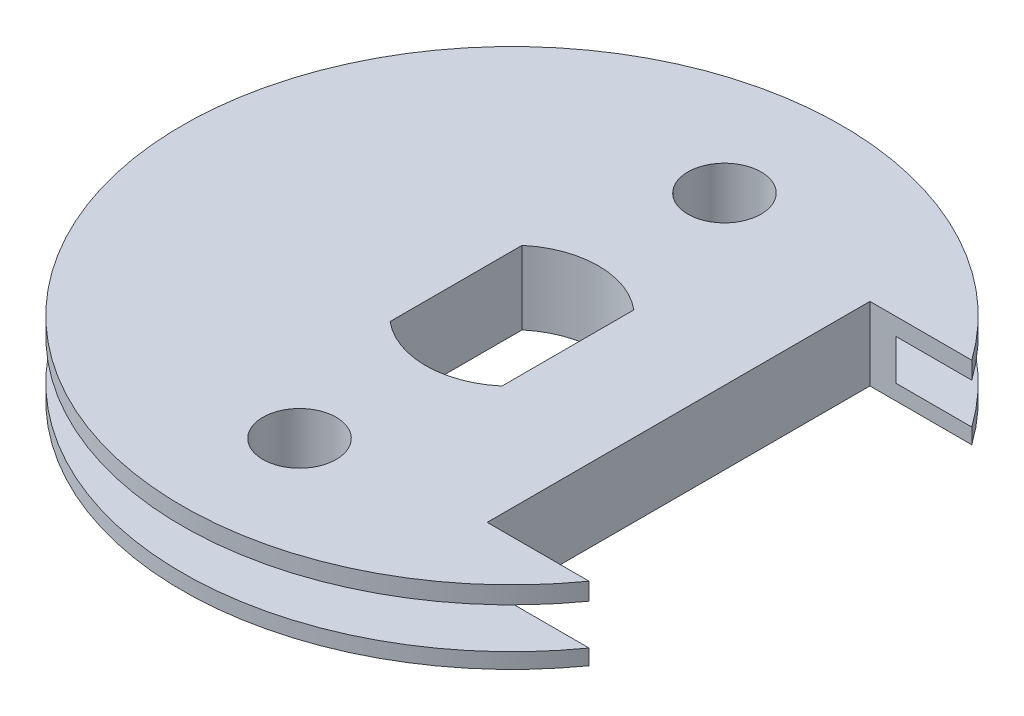
ISO-10303-21;
HEADER;
FILE_DESCRIPTION(('STEP AP214'),'2;1');
FILE_NAME('part.step','',(''),(''),'','','');
FILE_SCHEMA(('AUTOMOTIVE_DESIGN { 1 0 10303 214 1 1 1 1 }'));
ENDSEC;
DATA;
#1=APPLICATION_CONTEXT('core data for automotive mechanical design processes');
#2=APPLICATION_PROTOCOL_DEFINITION('international standard','automotive_design',2000,#1);
#3=PRODUCT_CONTEXT('',#1,'mechanical');
#4=PRODUCT('Part','Part','',(#3));
#5=PRODUCT_RELATED_PRODUCT_CATEGORY('part','',(#4));
#6=PRODUCT_DEFINITION_FORMATION('','',#4);
#7=PRODUCT_DEFINITION_CONTEXT('part definition',#1,'design');
#8=PRODUCT_DEFINITION('design','',#6,#7);
#9=PRODUCT_DEFINITION_SHAPE('','',#8);
#10=(LENGTH_UNIT() NAMED_UNIT(*) SI_UNIT(.MILLI.,.METRE.));
#11=(NAMED_UNIT(*) PLANE_ANGLE_UNIT() SI_UNIT($,.RADIAN.));
#12=(NAMED_UNIT(*) SI_UNIT($,.STERADIAN.) SOLID_ANGLE_UNIT());
#13=UNCERTAINTY_MEASURE_WITH_UNIT(LENGTH_MEASURE(1.E-05),#10,'distance_accuracy_value','');
#14=(GEOMETRIC_REPRESENTATION_CONTEXT(3) GLOBAL_UNCERTAINTY_ASSIGNED_CONTEXT((#13)) GLOBAL_UNIT_ASSIGNED_CONTEXT((#10,
#11,#12)) REPRESENTATION_CONTEXT('',''));
#15=CARTESIAN_POINT('',(0.,0.,0.));
#16=DIRECTION('',(0.,0.,1.));
#17=DIRECTION('',(1.,0.,0.));
#18=AXIS2_PLACEMENT_3D('',#15,#16,#17);
#19=CARTESIAN_POINT('',(0.,2.,0.));
#20=DIRECTION('',(0.,-1.,0.));
#21=DIRECTION('',(0.,0.,-1.));
#22=AXIS2_PLACEMENT_3D('',#19,#20,#21);
#23=CYLINDRICAL_SURFACE('',#22,9.);
#24=DIRECTION('',(0.,-1.,0.));
#25=VECTOR('',#24,1.);
#26=CARTESIAN_POINT('',(7.32834949851226,2.,-5.22448979591836));
#27=LINE('',#26,#25);
#28=CARTESIAN_POINT('',(7.32834949851226,1.52650821623979,-5.22448979591836));
#29=VERTEX_POINT('',#28);
#30=CARTESIAN_POINT('',(7.32834949851226,2.,-5.22448979591836));
#31=VERTEX_POINT('',#30);
#32=EDGE_CURVE('E208',#29,#31,#27,.F.);
#33=ORIENTED_EDGE('',*,*,#32,.F.);
#34=CARTESIAN_POINT('',(0.,1.52650821623979,0.));
#35=DIRECTION('',(0.,-1.,0.));
#36=DIRECTION('',(0.,0.,-1.));
#37=AXIS2_PLACEMENT_3D('',#34,#35,#36);
#38=CIRCLE('',#37,9.);
#39=CARTESIAN_POINT('',(7.32834949851226,1.52650821623979,5.22448979591836));
#40=VERTEX_POINT('',#39);
#41=EDGE_CURVE('E231',#40,#29,#38,.T.);
#42=ORIENTED_EDGE('',*,*,#41,.F.);
#43=DIRECTION('',(0.,-1.,0.));
#44=VECTOR('',#43,1.);
#45=CARTESIAN_POINT('',(7.32834949851226,2.,5.22448979591836));
#46=LINE('',#45,#44);
#47=CARTESIAN_POINT('',(7.32834949851226,2.,5.22448979591836));
#48=VERTEX_POINT('',#47);
#49=EDGE_CURVE('E192',#48,#40,#46,.T.);
#50=ORIENTED_EDGE('',*,*,#49,.F.);
#51=CARTESIAN_POINT('',(0.,2.,0.));
#52=DIRECTION('',(0.,1.,0.));
#53=DIRECTION('',(0.,0.,1.));
#54=AXIS2_PLACEMENT_3D('',#51,#52,#53);
#55=CIRCLE('',#54,9.);
#56=EDGE_CURVE('E252',#31,#48,#55,.T.);
#57=ORIENTED_EDGE('',*,*,#56,.F.);
#58=EDGE_LOOP('',(#33,#42,#50,#57));
#59=FACE_BOUND('',#58,.T.);
#60=ADVANCED_FACE('F41',(#59),#23,.T.);
#61=DIRECTION('',(0.,-1.,0.));
#62=VECTOR('',#61,1.);
#63=CARTESIAN_POINT('',(7.32834949851226,2.,-5.22448979591836));
#64=LINE('',#63,#62);
#65=CARTESIAN_POINT('',(7.32834949851226,0.,-5.22448979591836));
#66=VERTEX_POINT('',#65);
#67=CARTESIAN_POINT('',(7.32834949851226,0.419519154645888,-5.22448979591836));
#68=VERTEX_POINT('',#67);
#69=EDGE_CURVE('E205',#66,#68,#64,.F.);
#70=ORIENTED_EDGE('',*,*,#69,.F.);
#71=CARTESIAN_POINT('',(0.,0.,0.));
#72=DIRECTION('',(0.,1.,0.));
#73=DIRECTION('',(0.,0.,1.));
#74=AXIS2_PLACEMENT_3D('',#71,#72,#73);
#75=CIRCLE('',#74,9.);
#76=CARTESIAN_POINT('',(7.32834949851226,0.,5.22448979591836));
#77=VERTEX_POINT('',#76);
#78=EDGE_CURVE('E240',#66,#77,#75,.T.);
#79=ORIENTED_EDGE('',*,*,#78,.T.);
#80=DIRECTION('',(0.,-1.,0.));
#81=VECTOR('',#80,1.);
#82=CARTESIAN_POINT('',(7.32834949851226,2.,5.22448979591836));
#83=LINE('',#82,#81);
#84=CARTESIAN_POINT('',(7.32834949851226,0.419519154645888,5.22448979591836));
#85=VERTEX_POINT('',#84);
#86=EDGE_CURVE('E189',#85,#77,#83,.T.);
#87=ORIENTED_EDGE('',*,*,#86,.F.);
#88=CARTESIAN_POINT('',(0.,0.419519154645888,0.));
#89=DIRECTION('',(0.,-1.,0.));
#90=DIRECTION('',(0.,0.,-1.));
#91=AXIS2_PLACEMENT_3D('',#88,#89,#90);
#92=CIRCLE('',#91,9.);
#93=EDGE_CURVE('E219',#85,#68,#92,.T.);
#94=ORIENTED_EDGE('',*,*,#93,.T.);
#95=EDGE_LOOP('',(#70,#79,#87,#94));
#96=FACE_BOUND('',#95,.T.);
#97=ADVANCED_FACE('F274',(#96),#23,.T.);
#98=CARTESIAN_POINT('',(0.,2.,0.));
#99=DIRECTION('',(0.,1.,0.));
#100=DIRECTION('',(0.,0.,1.));
#101=AXIS2_PLACEMENT_3D('',#98,#99,#100);
#102=PLANE('',#101);
#103=CARTESIAN_POINT('',(0.,2.,0.));
#104=DIRECTION('',(0.,1.,0.));
#105=DIRECTION('',(0.,0.,1.));
#106=AXIS2_PLACEMENT_3D('',#103,#104,#105);
#107=CIRCLE('',#106,2.36);
#108=CARTESIAN_POINT('',(1.52630272226711,2.,-1.8));
#109=VERTEX_POINT('',#108);
#110=CARTESIAN_POINT('',(-1.52630272226711,2.,-1.8));
#111=VERTEX_POINT('',#110);
#112=EDGE_CURVE('E134',#109,#111,#107,.T.);
#113=ORIENTED_EDGE('',*,*,#112,.F.);
#114=DIRECTION('',(0.,0.,1.));
#115=VECTOR('',#114,1.);
#116=CARTESIAN_POINT('',(1.52630272226711,2.,-1.8));
#117=LINE('',#116,#115);
#118=CARTESIAN_POINT('',(1.52630272226711,2.,1.8));
#119=VERTEX_POINT('',#118);
#120=EDGE_CURVE('E168',#109,#119,#117,.T.);
#121=ORIENTED_EDGE('',*,*,#120,.T.);
#122=CARTESIAN_POINT('',(0.,2.,0.));
#123=DIRECTION('',(0.,1.,0.));
#124=DIRECTION('',(0.,0.,1.));
#125=AXIS2_PLACEMENT_3D('',#122,#123,#124);
#126=CIRCLE('',#125,2.36);
#127=CARTESIAN_POINT('',(-1.52630272226711,2.,1.8));
#128=VERTEX_POINT('',#127);
#129=EDGE_CURVE('E64',#128,#119,#126,.T.);
#130=ORIENTED_EDGE('',*,*,#129,.F.);
#131=DIRECTION('',(0.,0.,-1.));
#132=VECTOR('',#131,1.);
#133=CARTESIAN_POINT('',(-1.52630272226711,2.,-1.8));
#134=LINE('',#133,#132);
#135=EDGE_CURVE('E159',#128,#111,#134,.T.);
#136=ORIENTED_EDGE('',*,*,#135,.T.);
#137=EDGE_LOOP('',(#113,#121,#130,#136));
#138=FACE_BOUND('',#137,.T.);
#139=CARTESIAN_POINT('',(0.,2.,-5.8));
#140=DIRECTION('',(0.,1.,0.));
#141=DIRECTION('',(0.,0.,1.));
#142=AXIS2_PLACEMENT_3D('',#139,#140,#141);
#143=CIRCLE('',#142,1.);
#144=CARTESIAN_POINT('',(0.,2.,-4.8));
#145=VERTEX_POINT('',#144);
#146=EDGE_CURVE('E241',#145,#145,#143,.T.);
#147=ORIENTED_EDGE('',*,*,#146,.F.);
#148=EDGE_LOOP('',(#147));
#149=FACE_BOUND('',#148,.T.);
#150=CARTESIAN_POINT('',(0.,2.,5.8));
#151=DIRECTION('',(0.,1.,0.));
#152=DIRECTION('',(0.,0.,-1.));
#153=AXIS2_PLACEMENT_3D('',#150,#151,#152);
#154=CIRCLE('',#153,1.);
#155=CARTESIAN_POINT('',(0.,2.,4.8));
#156=VERTEX_POINT('',#155);
#157=EDGE_CURVE('E235',#156,#156,#154,.T.);
#158=ORIENTED_EDGE('',*,*,#157,.F.);
#159=EDGE_LOOP('',(#158));
#160=FACE_BOUND('',#159,.T.);
#161=DIRECTION('',(0.,0.,-1.));
#162=VECTOR('',#161,1.);
#163=CARTESIAN_POINT('',(4.54724111866969,2.,0.));
#164=LINE('',#163,#162);
#165=CARTESIAN_POINT('',(4.54724111866969,2.,5.22448979591836));
#166=VERTEX_POINT('',#165);
#167=CARTESIAN_POINT('',(4.54724111866969,2.,-5.22448979591836));
#168=VERTEX_POINT('',#167);
#169=EDGE_CURVE('E215',#166,#168,#164,.T.);
#170=ORIENTED_EDGE('',*,*,#169,.T.);
#171=DIRECTION('',(1.,0.,0.));
#172=VECTOR('',#171,1.);
#173=CARTESIAN_POINT('',(0.,2.,-5.22448979591836));
#174=LINE('',#173,#172);
#175=EDGE_CURVE('E211',#168,#31,#174,.T.);
#176=ORIENTED_EDGE('',*,*,#175,.T.);
#177=ORIENTED_EDGE('',*,*,#56,.T.);
#178=DIRECTION('',(-1.,0.,0.));
#179=VECTOR('',#178,1.);
#180=CARTESIAN_POINT('',(0.,2.,5.22448979591836));
#181=LINE('',#180,#179);
#182=EDGE_CURVE('E195',#48,#166,#181,.T.);
#183=ORIENTED_EDGE('',*,*,#182,.T.);
#184=EDGE_LOOP('',(#170,#176,#177,#183));
#185=FACE_BOUND('',#184,.T.);
#186=ADVANCED_FACE('F294',(#138,#149,#160,#185),#102,.T.);
#187=CARTESIAN_POINT('',(0.,0.,0.));
#188=DIRECTION('',(0.,1.,0.));
#189=DIRECTION('',(0.,0.,1.));
#190=AXIS2_PLACEMENT_3D('',#187,#188,#189);
#191=PLANE('',#190);
#192=DIRECTION('',(0.,0.,1.));
#193=VECTOR('',#192,1.);
#194=CARTESIAN_POINT('',(1.52630272226711,0.,-1.8));
#195=LINE('',#194,#193);
#196=CARTESIAN_POINT('',(1.52630272226711,0.,-1.8));
#197=VERTEX_POINT('',#196);
#198=CARTESIAN_POINT('',(1.52630272226711,0.,1.8));
#199=VERTEX_POINT('',#198);
#200=EDGE_CURVE('E151',#197,#199,#195,.T.);
#201=ORIENTED_EDGE('',*,*,#200,.F.);
#202=CARTESIAN_POINT('',(0.,0.,0.));
#203=DIRECTION('',(0.,1.,0.));
#204=DIRECTION('',(0.,0.,1.));
#205=AXIS2_PLACEMENT_3D('',#202,#203,#204);
#206=CIRCLE('',#205,2.36);
#207=CARTESIAN_POINT('',(-1.52630272226711,0.,-1.8));
#208=VERTEX_POINT('',#207);
#209=EDGE_CURVE('E131',#197,#208,#206,.T.);
#210=ORIENTED_EDGE('',*,*,#209,.T.);
#211=DIRECTION('',(0.,0.,-1.));
#212=VECTOR('',#211,1.);
#213=CARTESIAN_POINT('',(-1.52630272226711,0.,-1.8));
#214=LINE('',#213,#212);
#215=CARTESIAN_POINT('',(-1.52630272226711,0.,1.8));
#216=VERTEX_POINT('',#215);
#217=EDGE_CURVE('E149',#216,#208,#214,.T.);
#218=ORIENTED_EDGE('',*,*,#217,.F.);
#219=CARTESIAN_POINT('',(0.,0.,0.));
#220=DIRECTION('',(0.,1.,0.));
#221=DIRECTION('',(0.,0.,1.));
#222=AXIS2_PLACEMENT_3D('',#219,#220,#221);
#223=CIRCLE('',#222,2.36);
#224=EDGE_CURVE('E153',#216,#199,#223,.T.);
#225=ORIENTED_EDGE('',*,*,#224,.T.);
#226=EDGE_LOOP('',(#201,#210,#218,#225));
#227=FACE_BOUND('',#226,.T.);
#228=CARTESIAN_POINT('',(0.,0.,5.8));
#229=DIRECTION('',(0.,1.,0.));
#230=DIRECTION('',(0.,0.,-1.));
#231=AXIS2_PLACEMENT_3D('',#228,#229,#230);
#232=CIRCLE('',#231,1.);
#233=CARTESIAN_POINT('',(0.,0.,4.8));
#234=VERTEX_POINT('',#233);
#235=EDGE_CURVE('E245',#234,#234,#232,.T.);
#236=ORIENTED_EDGE('',*,*,#235,.T.);
#237=EDGE_LOOP('',(#236));
#238=FACE_BOUND('',#237,.T.);
#239=CARTESIAN_POINT('',(0.,0.,-5.8));
#240=DIRECTION('',(0.,1.,0.));
#241=DIRECTION('',(0.,0.,1.));
#242=AXIS2_PLACEMENT_3D('',#239,#240,#241);
#243=CIRCLE('',#242,1.);
#244=CARTESIAN_POINT('',(0.,0.,-4.8));
#245=VERTEX_POINT('',#244);
#246=EDGE_CURVE('E236',#245,#245,#243,.T.);
#247=ORIENTED_EDGE('',*,*,#246,.T.);
#248=EDGE_LOOP('',(#247));
#249=FACE_BOUND('',#248,.T.);
#250=DIRECTION('',(-1.,0.,0.));
#251=VECTOR('',#250,1.);
#252=CARTESIAN_POINT('',(5.92592592592592,0.,-5.22448979591836));
#253=LINE('',#252,#251);
#254=CARTESIAN_POINT('',(4.54724111866969,0.,-5.22448979591836));
#255=VERTEX_POINT('',#254);
#256=EDGE_CURVE('E158',#66,#255,#253,.T.);
#257=ORIENTED_EDGE('',*,*,#256,.T.);
#258=DIRECTION('',(0.,0.,1.));
#259=VECTOR('',#258,1.);
#260=CARTESIAN_POINT('',(4.54724111866969,0.,-5.22448979591836));
#261=LINE('',#260,#259);
#262=CARTESIAN_POINT('',(4.54724111866969,0.,5.22448979591836));
#263=VERTEX_POINT('',#262);
#264=EDGE_CURVE('E164',#255,#263,#261,.T.);
#265=ORIENTED_EDGE('',*,*,#264,.T.);
#266=DIRECTION('',(1.,0.,0.));
#267=VECTOR('',#266,1.);
#268=CARTESIAN_POINT('',(10.59410430839,0.,5.22448979591836));
#269=LINE('',#268,#267);
#270=EDGE_CURVE('E174',#263,#77,#269,.T.);
#271=ORIENTED_EDGE('',*,*,#270,.T.);
#272=ORIENTED_EDGE('',*,*,#78,.F.);
#273=EDGE_LOOP('',(#257,#265,#271,#272));
#274=FACE_BOUND('',#273,.T.);
#275=ADVANCED_FACE('F146',(#227,#238,#249,#274),#191,.F.);
#276=CARTESIAN_POINT('',(8.09522994134982,1.52650821623979,0.));
#277=DIRECTION('',(0.,1.,0.));
#278=DIRECTION('',(0.,0.,1.));
#279=AXIS2_PLACEMENT_3D('',#276,#277,#278);
#280=PLANE('',#279);
#281=DIRECTION('',(1.,0.,0.));
#282=VECTOR('',#281,1.);
#283=CARTESIAN_POINT('',(8.09522994134982,1.52650821623979,-5.22448979591836));
#284=LINE('',#283,#282);
#285=CARTESIAN_POINT('',(5.2534592975697,1.52650821623979,-5.22448979591836));
#286=VERTEX_POINT('',#285);
#287=EDGE_CURVE('E202',#286,#29,#284,.T.);
#288=ORIENTED_EDGE('',*,*,#287,.F.);
#289=CARTESIAN_POINT('',(0.,1.52650821623979,0.));
#290=DIRECTION('',(0.,-1.,0.));
#291=DIRECTION('',(0.,0.,-1.));
#292=AXIS2_PLACEMENT_3D('',#289,#290,#291);
#293=CIRCLE('',#292,7.40905717476094);
#294=CARTESIAN_POINT('',(5.2534592975697,1.52650821623979,5.22448979591836));
#295=VERTEX_POINT('',#294);
#296=EDGE_CURVE('E227',#295,#286,#293,.T.);
#297=ORIENTED_EDGE('',*,*,#296,.F.);
#298=DIRECTION('',(-1.,0.,0.));
#299=VECTOR('',#298,1.);
#300=CARTESIAN_POINT('',(8.09522994134982,1.52650821623979,5.22448979591836));
#301=LINE('',#300,#299);
#302=EDGE_CURVE('E186',#40,#295,#301,.T.);
#303=ORIENTED_EDGE('',*,*,#302,.F.);
#304=ORIENTED_EDGE('',*,*,#41,.T.);
#305=EDGE_LOOP('',(#288,#297,#303,#304));
#306=FACE_BOUND('',#305,.T.);
#307=ADVANCED_FACE('F287',(#306),#280,.F.);
#308=CARTESIAN_POINT('',(0.,0.,0.));
#309=DIRECTION('',(0.,-1.,0.));
#310=DIRECTION('',(0.,0.,-1.));
#311=AXIS2_PLACEMENT_3D('',#308,#309,#310);
#312=CYLINDRICAL_SURFACE('',#311,7.40905717476094);
#313=DIRECTION('',(0.,-1.,0.));
#314=VECTOR('',#313,1.);
#315=CARTESIAN_POINT('',(5.2534592975697,0.,-5.22448979591836));
#316=LINE('',#315,#314);
#317=CARTESIAN_POINT('',(5.2534592975697,0.419519154645888,-5.22448979591836));
#318=VERTEX_POINT('',#317);
#319=EDGE_CURVE('E199',#318,#286,#316,.F.);
#320=ORIENTED_EDGE('',*,*,#319,.F.);
#321=CARTESIAN_POINT('',(0.,0.419519154645888,0.));
#322=DIRECTION('',(0.,-1.,0.));
#323=DIRECTION('',(0.,0.,-1.));
#324=AXIS2_PLACEMENT_3D('',#321,#322,#323);
#325=CIRCLE('',#324,7.40905717476094);
#326=CARTESIAN_POINT('',(5.2534592975697,0.419519154645888,5.22448979591836));
#327=VERTEX_POINT('',#326);
#328=EDGE_CURVE('E223',#327,#318,#325,.T.);
#329=ORIENTED_EDGE('',*,*,#328,.F.);
#330=DIRECTION('',(0.,-1.,0.));
#331=VECTOR('',#330,1.);
#332=CARTESIAN_POINT('',(5.2534592975697,0.,5.22448979591836));
#333=LINE('',#332,#331);
#334=EDGE_CURVE('E56',#295,#327,#333,.T.);
#335=ORIENTED_EDGE('',*,*,#334,.F.);
#336=ORIENTED_EDGE('',*,*,#296,.T.);
#337=EDGE_LOOP('',(#320,#329,#335,#336));
#338=FACE_BOUND('',#337,.T.);
#339=ADVANCED_FACE('F283',(#338),#312,.T.);
#340=CARTESIAN_POINT('',(8.09522994134982,0.419519154645888,0.));
#341=DIRECTION('',(0.,-1.,0.));
#342=DIRECTION('',(0.,0.,-1.));
#343=AXIS2_PLACEMENT_3D('',#340,#341,#342);
#344=PLANE('',#343);
#345=DIRECTION('',(-1.,0.,0.));
#346=VECTOR('',#345,1.);
#347=CARTESIAN_POINT('',(8.09522994134982,0.419519154645888,-5.22448979591836));
#348=LINE('',#347,#346);
#349=EDGE_CURVE('E11',#68,#318,#348,.T.);
#350=ORIENTED_EDGE('',*,*,#349,.F.);
#351=ORIENTED_EDGE('',*,*,#93,.F.);
#352=DIRECTION('',(1.,0.,0.));
#353=VECTOR('',#352,1.);
#354=CARTESIAN_POINT('',(8.09522994134982,0.419519154645888,5.22448979591836));
#355=LINE('',#354,#353);
#356=EDGE_CURVE('E49',#327,#85,#355,.T.);
#357=ORIENTED_EDGE('',*,*,#356,.F.);
#358=ORIENTED_EDGE('',*,*,#328,.T.);
#359=EDGE_LOOP('',(#350,#351,#357,#358));
#360=FACE_BOUND('',#359,.T.);
#361=ADVANCED_FACE('F277',(#360),#344,.F.);
#362=CARTESIAN_POINT('',(0.,0.,5.8));
#363=DIRECTION('',(0.,1.,0.));
#364=DIRECTION('',(0.,0.,1.));
#365=AXIS2_PLACEMENT_3D('',#362,#363,#364);
#366=CYLINDRICAL_SURFACE('',#365,1.);
#367=ORIENTED_EDGE('',*,*,#235,.F.);
#368=EDGE_LOOP('',(#367));
#369=FACE_BOUND('',#368,.T.);
#370=ORIENTED_EDGE('',*,*,#157,.T.);
#371=EDGE_LOOP('',(#370));
#372=FACE_BOUND('',#371,.T.);
#373=ADVANCED_FACE('F379',(#369,#372),#366,.F.);
#374=CARTESIAN_POINT('',(0.,0.,-5.8));
#375=DIRECTION('',(0.,1.,0.));
#376=DIRECTION('',(0.,0.,1.));
#377=AXIS2_PLACEMENT_3D('',#374,#375,#376);
#378=CYLINDRICAL_SURFACE('',#377,1.);
#379=ORIENTED_EDGE('',*,*,#246,.F.);
#380=EDGE_LOOP('',(#379));
#381=FACE_BOUND('',#380,.T.);
#382=ORIENTED_EDGE('',*,*,#146,.T.);
#383=EDGE_LOOP('',(#382));
#384=FACE_BOUND('',#383,.T.);
#385=ADVANCED_FACE('F376',(#381,#384),#378,.F.);
#386=CARTESIAN_POINT('',(5.92592592592592,4.,-5.22448979591836));
#387=DIRECTION('',(0.,0.,1.));
#388=DIRECTION('',(1.,0.,0.));
#389=AXIS2_PLACEMENT_3D('',#386,#387,#388);
#390=PLANE('',#389);
#391=DIRECTION('',(0.,-1.,0.));
#392=VECTOR('',#391,1.);
#393=CARTESIAN_POINT('',(4.54724111866969,4.,-5.22448979591836));
#394=LINE('',#393,#392);
#395=EDGE_CURVE('E181',#168,#255,#394,.T.);
#396=ORIENTED_EDGE('',*,*,#395,.T.);
#397=ORIENTED_EDGE('',*,*,#256,.F.);
#398=ORIENTED_EDGE('',*,*,#69,.T.);
#399=ORIENTED_EDGE('',*,*,#349,.T.);
#400=ORIENTED_EDGE('',*,*,#319,.T.);
#401=ORIENTED_EDGE('',*,*,#287,.T.);
#402=ORIENTED_EDGE('',*,*,#32,.T.);
#403=ORIENTED_EDGE('',*,*,#175,.F.);
#404=EDGE_LOOP('',(#396,#397,#398,#399,#400,#401,#402,#403));
#405=FACE_BOUND('',#404,.T.);
#406=ADVANCED_FACE('F280',(#405),#390,.T.);
#407=CARTESIAN_POINT('',(4.54724111866969,4.,-5.22448979591836));
#408=DIRECTION('',(1.,0.,0.));
#409=DIRECTION('',(0.,0.,-1.));
#410=AXIS2_PLACEMENT_3D('',#407,#408,#409);
#411=PLANE('',#410);
#412=DIRECTION('',(0.,-1.,0.));
#413=VECTOR('',#412,1.);
#414=CARTESIAN_POINT('',(4.54724111866969,4.,5.22448979591836));
#415=LINE('',#414,#413);
#416=EDGE_CURVE('E178',#166,#263,#415,.T.);
#417=ORIENTED_EDGE('',*,*,#416,.T.);
#418=ORIENTED_EDGE('',*,*,#264,.F.);
#419=ORIENTED_EDGE('',*,*,#395,.F.);
#420=ORIENTED_EDGE('',*,*,#169,.F.);
#421=EDGE_LOOP('',(#417,#418,#419,#420));
#422=FACE_BOUND('',#421,.T.);
#423=ADVANCED_FACE('F298',(#422),#411,.T.);
#424=CARTESIAN_POINT('',(10.59410430839,4.,5.22448979591836));
#425=DIRECTION('',(0.,0.,-1.));
#426=DIRECTION('',(-1.,0.,0.));
#427=AXIS2_PLACEMENT_3D('',#424,#425,#426);
#428=PLANE('',#427);
#429=ORIENTED_EDGE('',*,*,#49,.T.);
#430=ORIENTED_EDGE('',*,*,#302,.T.);
#431=ORIENTED_EDGE('',*,*,#334,.T.);
#432=ORIENTED_EDGE('',*,*,#356,.T.);
#433=ORIENTED_EDGE('',*,*,#86,.T.);
#434=ORIENTED_EDGE('',*,*,#270,.F.);
#435=ORIENTED_EDGE('',*,*,#416,.F.);
#436=ORIENTED_EDGE('',*,*,#182,.F.);
#437=EDGE_LOOP('',(#429,#430,#431,#432,#433,#434,#435,#436));
#438=FACE_BOUND('',#437,.T.);
#439=ADVANCED_FACE('F267',(#438),#428,.T.);
#440=CARTESIAN_POINT('',(-1.52630272226711,0.,-1.8));
#441=DIRECTION('',(1.,0.,0.));
#442=DIRECTION('',(0.,0.,-1.));
#443=AXIS2_PLACEMENT_3D('',#440,#441,#442);
#444=PLANE('',#443);
#445=ORIENTED_EDGE('',*,*,#135,.F.);
#446=DIRECTION('',(0.,-1.,0.));
#447=VECTOR('',#446,1.);
#448=CARTESIAN_POINT('',(-1.52630272226711,2.,1.8));
#449=LINE('',#448,#447);
#450=EDGE_CURVE('E140',#128,#216,#449,.T.);
#451=ORIENTED_EDGE('',*,*,#450,.T.);
#452=ORIENTED_EDGE('',*,*,#217,.T.);
#453=DIRECTION('',(0.,-1.,0.));
#454=VECTOR('',#453,1.);
#455=CARTESIAN_POINT('',(-1.52630272226711,2.,-1.8));
#456=LINE('',#455,#454);
#457=EDGE_CURVE('E128',#111,#208,#456,.T.);
#458=ORIENTED_EDGE('',*,*,#457,.F.);
#459=EDGE_LOOP('',(#445,#451,#452,#458));
#460=FACE_BOUND('',#459,.T.);
#461=ADVANCED_FACE('F156',(#460),#444,.T.);
#462=CARTESIAN_POINT('',(1.52630272226711,0.,-1.8));
#463=DIRECTION('',(-1.,0.,0.));
#464=DIRECTION('',(0.,0.,1.));
#465=AXIS2_PLACEMENT_3D('',#462,#463,#464);
#466=PLANE('',#465);
#467=ORIENTED_EDGE('',*,*,#120,.F.);
#468=DIRECTION('',(0.,-1.,0.));
#469=VECTOR('',#468,1.);
#470=CARTESIAN_POINT('',(1.52630272226711,2.,-1.8));
#471=LINE('',#470,#469);
#472=EDGE_CURVE('E141',#109,#197,#471,.T.);
#473=ORIENTED_EDGE('',*,*,#472,.T.);
#474=ORIENTED_EDGE('',*,*,#200,.T.);
#475=DIRECTION('',(0.,-1.,0.));
#476=VECTOR('',#475,1.);
#477=CARTESIAN_POINT('',(1.52630272226711,2.,1.8));
#478=LINE('',#477,#476);
#479=EDGE_CURVE('E263',#119,#199,#478,.T.);
#480=ORIENTED_EDGE('',*,*,#479,.F.);
#481=EDGE_LOOP('',(#467,#473,#474,#480));
#482=FACE_BOUND('',#481,.T.);
#483=ADVANCED_FACE('F340',(#482),#466,.T.);
#484=CARTESIAN_POINT('',(0.,0.,0.));
#485=DIRECTION('',(0.,1.,0.));
#486=DIRECTION('',(0.,0.,1.));
#487=AXIS2_PLACEMENT_3D('',#484,#485,#486);
#488=CYLINDRICAL_SURFACE('',#487,2.36);
#489=ORIENTED_EDGE('',*,*,#129,.T.);
#490=ORIENTED_EDGE('',*,*,#479,.T.);
#491=ORIENTED_EDGE('',*,*,#224,.F.);
#492=ORIENTED_EDGE('',*,*,#450,.F.);
#493=EDGE_LOOP('',(#489,#490,#491,#492));
#494=FACE_BOUND('',#493,.T.);
#495=ADVANCED_FACE('F349',(#494),#488,.F.);
#496=CARTESIAN_POINT('',(0.,0.,0.));
#497=DIRECTION('',(0.,1.,0.));
#498=DIRECTION('',(0.,0.,1.));
#499=AXIS2_PLACEMENT_3D('',#496,#497,#498);
#500=CYLINDRICAL_SURFACE('',#499,2.36);
#501=ORIENTED_EDGE('',*,*,#112,.T.);
#502=ORIENTED_EDGE('',*,*,#457,.T.);
#503=ORIENTED_EDGE('',*,*,#209,.F.);
#504=ORIENTED_EDGE('',*,*,#472,.F.);
#505=EDGE_LOOP('',(#501,#502,#503,#504));
#506=FACE_BOUND('',#505,.T.);
#507=ADVANCED_FACE('F130',(#506),#500,.F.);
#508=CLOSED_SHELL('',(#60,#97,#186,#275,#307,#339,#361,#373,#385,#406,#423,#439,#461,#483,#495,#507));
#509=MANIFOLD_SOLID_BREP('B2',#508);
#510=ADVANCED_BREP_SHAPE_REPRESENTATION('',(#18,#509),#14);
#511=SHAPE_DEFINITION_REPRESENTATION(#9,#510);
ENDSEC;
END-ISO-10303-21;
